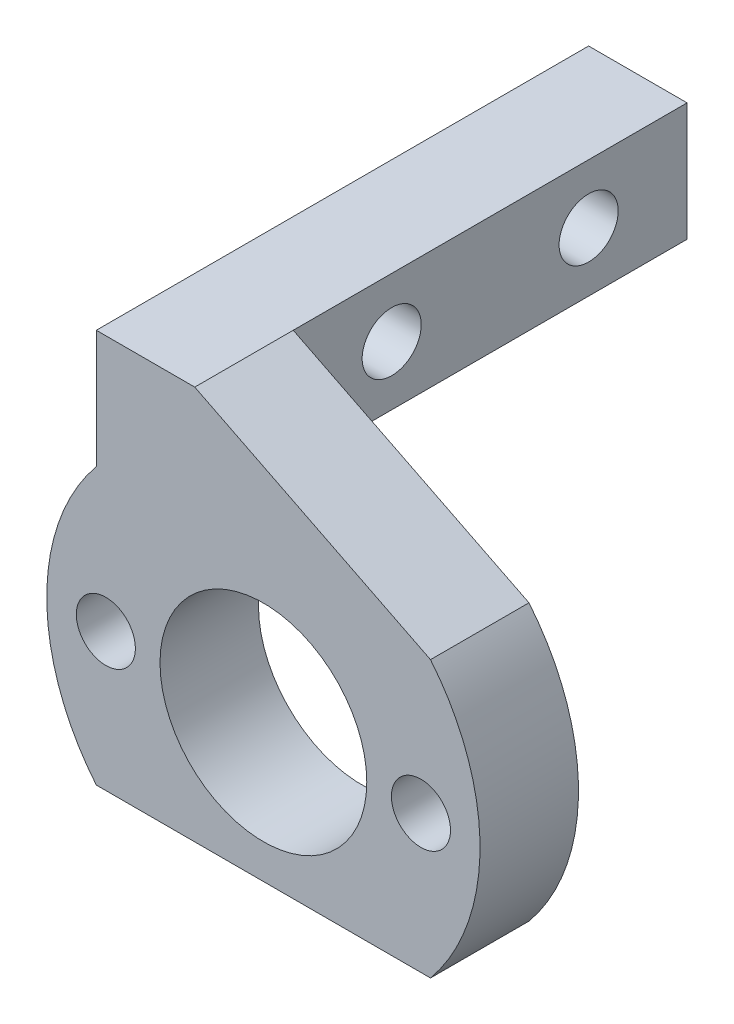
ISO-10303-21;
HEADER;
FILE_DESCRIPTION(('STEP AP214'),'2;1');
FILE_NAME('part.step','',(''),(''),'','','');
FILE_SCHEMA(('AUTOMOTIVE_DESIGN { 1 0 10303 214 1 1 1 1 }'));
ENDSEC;
DATA;
#1=APPLICATION_CONTEXT('core data for automotive mechanical design processes');
#2=APPLICATION_PROTOCOL_DEFINITION('international standard','automotive_design',2000,#1);
#3=PRODUCT_CONTEXT('',#1,'mechanical');
#4=PRODUCT('Part','Part','',(#3));
#5=PRODUCT_RELATED_PRODUCT_CATEGORY('part','',(#4));
#6=PRODUCT_DEFINITION_FORMATION('','',#4);
#7=PRODUCT_DEFINITION_CONTEXT('part definition',#1,'design');
#8=PRODUCT_DEFINITION('design','',#6,#7);
#9=PRODUCT_DEFINITION_SHAPE('','',#8);
#10=(LENGTH_UNIT() NAMED_UNIT(*) SI_UNIT(.MILLI.,.METRE.));
#11=(NAMED_UNIT(*) PLANE_ANGLE_UNIT() SI_UNIT($,.RADIAN.));
#12=(NAMED_UNIT(*) SI_UNIT($,.STERADIAN.) SOLID_ANGLE_UNIT());
#13=UNCERTAINTY_MEASURE_WITH_UNIT(LENGTH_MEASURE(1.E-05),#10,'distance_accuracy_value','');
#14=(GEOMETRIC_REPRESENTATION_CONTEXT(3) GLOBAL_UNCERTAINTY_ASSIGNED_CONTEXT((#13)) GLOBAL_UNIT_ASSIGNED_CONTEXT((#10,
#11,#12)) REPRESENTATION_CONTEXT('',''));
#15=CARTESIAN_POINT('',(0.,0.,0.));
#16=DIRECTION('',(0.,0.,1.));
#17=DIRECTION('',(1.,0.,0.));
#18=AXIS2_PLACEMENT_3D('',#15,#16,#17);
#19=CARTESIAN_POINT('',(5.,0.,0.));
#20=DIRECTION('',(-1.,0.,0.));
#21=DIRECTION('',(0.,0.,1.));
#22=AXIS2_PLACEMENT_3D('',#19,#20,#21);
#23=PLANE('',#22);
#24=DIRECTION('',(0.,-1.,0.));
#25=VECTOR('',#24,1.);
#26=CARTESIAN_POINT('',(5.,0.,0.));
#27=LINE('',#26,#25);
#28=CARTESIAN_POINT('',(5.,6.,0.));
#29=VERTEX_POINT('',#28);
#30=CARTESIAN_POINT('',(5.,0.,0.));
#31=VERTEX_POINT('',#30);
#32=EDGE_CURVE('E110',#29,#31,#27,.T.);
#33=ORIENTED_EDGE('',*,*,#32,.T.);
#34=DIRECTION('',(0.,0.,-1.));
#35=VECTOR('',#34,1.);
#36=CARTESIAN_POINT('',(5.,0.,0.));
#37=LINE('',#36,#35);
#38=CARTESIAN_POINT('',(5.,0.,-20.));
#39=VERTEX_POINT('',#38);
#40=EDGE_CURVE('E114',#31,#39,#37,.T.);
#41=ORIENTED_EDGE('',*,*,#40,.T.);
#42=DIRECTION('',(0.,1.,0.));
#43=VECTOR('',#42,1.);
#44=CARTESIAN_POINT('',(5.,0.,-20.));
#45=LINE('',#44,#43);
#46=CARTESIAN_POINT('',(5.,6.,-20.));
#47=VERTEX_POINT('',#46);
#48=EDGE_CURVE('E59',#39,#47,#45,.T.);
#49=ORIENTED_EDGE('',*,*,#48,.T.);
#50=DIRECTION('',(0.,0.,1.));
#51=VECTOR('',#50,1.);
#52=CARTESIAN_POINT('',(5.,6.,0.));
#53=LINE('',#52,#51);
#54=EDGE_CURVE('E119',#47,#29,#53,.T.);
#55=ORIENTED_EDGE('',*,*,#54,.T.);
#56=EDGE_LOOP('',(#33,#41,#49,#55));
#57=FACE_BOUND('',#56,.T.);
#58=CARTESIAN_POINT('',(5.,3.,-5.));
#59=DIRECTION('',(1.,0.,0.));
#60=DIRECTION('',(0.,0.,-1.));
#61=AXIS2_PLACEMENT_3D('',#58,#59,#60);
#62=CIRCLE('',#61,1.5);
#63=CARTESIAN_POINT('',(5.,3.,-6.5));
#64=VERTEX_POINT('',#63);
#65=EDGE_CURVE('E138',#64,#64,#62,.T.);
#66=ORIENTED_EDGE('',*,*,#65,.F.);
#67=EDGE_LOOP('',(#66));
#68=FACE_BOUND('',#67,.T.);
#69=CARTESIAN_POINT('',(5.,3.,-15.));
#70=DIRECTION('',(1.,0.,0.));
#71=DIRECTION('',(0.,0.,-1.));
#72=AXIS2_PLACEMENT_3D('',#69,#70,#71);
#73=CIRCLE('',#72,1.5);
#74=CARTESIAN_POINT('',(5.,3.,-16.5));
#75=VERTEX_POINT('',#74);
#76=EDGE_CURVE('E219',#75,#75,#73,.T.);
#77=ORIENTED_EDGE('',*,*,#76,.F.);
#78=EDGE_LOOP('',(#77));
#79=FACE_BOUND('',#78,.T.);
#80=ADVANCED_FACE('F41',(#57,#68,#79),#23,.F.);
#81=CARTESIAN_POINT('',(0.,0.,0.));
#82=DIRECTION('',(-1.,0.,0.));
#83=DIRECTION('',(0.,0.,1.));
#84=AXIS2_PLACEMENT_3D('',#81,#82,#83);
#85=PLANE('',#84);
#86=CARTESIAN_POINT('',(0.,3.,-5.));
#87=DIRECTION('',(1.,0.,0.));
#88=DIRECTION('',(0.,0.,-1.));
#89=AXIS2_PLACEMENT_3D('',#86,#87,#88);
#90=CIRCLE('',#89,1.5);
#91=CARTESIAN_POINT('',(0.,3.,-6.5));
#92=VERTEX_POINT('',#91);
#93=EDGE_CURVE('E128',#92,#92,#90,.T.);
#94=ORIENTED_EDGE('',*,*,#93,.T.);
#95=EDGE_LOOP('',(#94));
#96=FACE_BOUND('',#95,.T.);
#97=DIRECTION('',(0.,0.,-1.));
#98=VECTOR('',#97,1.);
#99=CARTESIAN_POINT('',(0.,0.,0.));
#100=LINE('',#99,#98);
#101=CARTESIAN_POINT('',(0.,0.,0.));
#102=VERTEX_POINT('',#101);
#103=CARTESIAN_POINT('',(0.,0.,-20.));
#104=VERTEX_POINT('',#103);
#105=EDGE_CURVE('E70',#102,#104,#100,.T.);
#106=ORIENTED_EDGE('',*,*,#105,.F.);
#107=DIRECTION('',(0.,0.,-1.));
#108=VECTOR('',#107,1.);
#109=CARTESIAN_POINT('',(0.,0.,5.));
#110=LINE('',#109,#108);
#111=CARTESIAN_POINT('',(0.,0.,5.));
#112=VERTEX_POINT('',#111);
#113=EDGE_CURVE('E205',#112,#102,#110,.T.);
#114=ORIENTED_EDGE('',*,*,#113,.F.);
#115=DIRECTION('',(0.,1.,0.));
#116=VECTOR('',#115,1.);
#117=CARTESIAN_POINT('',(0.,0.,5.));
#118=LINE('',#117,#116);
#119=CARTESIAN_POINT('',(0.,6.,5.));
#120=VERTEX_POINT('',#119);
#121=EDGE_CURVE('E152',#112,#120,#118,.T.);
#122=ORIENTED_EDGE('',*,*,#121,.T.);
#123=DIRECTION('',(0.,0.,1.));
#124=VECTOR('',#123,1.);
#125=CARTESIAN_POINT('',(0.,6.,0.));
#126=LINE('',#125,#124);
#127=CARTESIAN_POINT('',(0.,6.,-20.));
#128=VERTEX_POINT('',#127);
#129=EDGE_CURVE('E121',#128,#120,#126,.T.);
#130=ORIENTED_EDGE('',*,*,#129,.F.);
#131=DIRECTION('',(0.,1.,0.));
#132=VECTOR('',#131,1.);
#133=CARTESIAN_POINT('',(0.,0.,-20.));
#134=LINE('',#133,#132);
#135=EDGE_CURVE('E125',#104,#128,#134,.T.);
#136=ORIENTED_EDGE('',*,*,#135,.F.);
#137=EDGE_LOOP('',(#106,#114,#122,#130,#136));
#138=FACE_BOUND('',#137,.T.);
#139=CARTESIAN_POINT('',(0.,3.,-15.));
#140=DIRECTION('',(1.,0.,0.));
#141=DIRECTION('',(0.,0.,-1.));
#142=AXIS2_PLACEMENT_3D('',#139,#140,#141);
#143=CIRCLE('',#142,1.5);
#144=CARTESIAN_POINT('',(0.,3.,-16.5));
#145=VERTEX_POINT('',#144);
#146=EDGE_CURVE('E218',#145,#145,#143,.T.);
#147=ORIENTED_EDGE('',*,*,#146,.T.);
#148=EDGE_LOOP('',(#147));
#149=FACE_BOUND('',#148,.T.);
#150=ADVANCED_FACE('F149',(#96,#138,#149),#85,.T.);
#151=CARTESIAN_POINT('',(5.,0.,0.));
#152=DIRECTION('',(0.,1.,0.));
#153=DIRECTION('',(0.,0.,1.));
#154=AXIS2_PLACEMENT_3D('',#151,#152,#153);
#155=PLANE('',#154);
#156=ORIENTED_EDGE('',*,*,#105,.T.);
#157=DIRECTION('',(-1.,0.,0.));
#158=VECTOR('',#157,1.);
#159=CARTESIAN_POINT('',(5.,0.,-20.));
#160=LINE('',#159,#158);
#161=EDGE_CURVE('E51',#39,#104,#160,.T.);
#162=ORIENTED_EDGE('',*,*,#161,.F.);
#163=ORIENTED_EDGE('',*,*,#40,.F.);
#164=DIRECTION('',(-1.,0.,0.));
#165=VECTOR('',#164,1.);
#166=CARTESIAN_POINT('',(5.,0.,0.));
#167=LINE('',#166,#165);
#168=EDGE_CURVE('E11',#31,#102,#167,.T.);
#169=ORIENTED_EDGE('',*,*,#168,.T.);
#170=EDGE_LOOP('',(#156,#162,#163,#169));
#171=FACE_BOUND('',#170,.T.);
#172=ADVANCED_FACE('F43',(#171),#155,.F.);
#173=CARTESIAN_POINT('',(5.,0.,-20.));
#174=DIRECTION('',(0.,0.,1.));
#175=DIRECTION('',(1.,0.,0.));
#176=AXIS2_PLACEMENT_3D('',#173,#174,#175);
#177=PLANE('',#176);
#178=ORIENTED_EDGE('',*,*,#135,.T.);
#179=DIRECTION('',(-1.,0.,0.));
#180=VECTOR('',#179,1.);
#181=CARTESIAN_POINT('',(5.,6.,-20.));
#182=LINE('',#181,#180);
#183=EDGE_CURVE('E135',#47,#128,#182,.T.);
#184=ORIENTED_EDGE('',*,*,#183,.F.);
#185=ORIENTED_EDGE('',*,*,#48,.F.);
#186=ORIENTED_EDGE('',*,*,#161,.T.);
#187=EDGE_LOOP('',(#178,#184,#185,#186));
#188=FACE_BOUND('',#187,.T.);
#189=ADVANCED_FACE('F146',(#188),#177,.F.);
#190=CARTESIAN_POINT('',(5.,6.,0.));
#191=DIRECTION('',(0.,-1.,0.));
#192=DIRECTION('',(0.,0.,-1.));
#193=AXIS2_PLACEMENT_3D('',#190,#191,#192);
#194=PLANE('',#193);
#195=ORIENTED_EDGE('',*,*,#129,.T.);
#196=DIRECTION('',(1.,0.,0.));
#197=VECTOR('',#196,1.);
#198=CARTESIAN_POINT('',(0.,6.,5.));
#199=LINE('',#198,#197);
#200=CARTESIAN_POINT('',(5.,6.,5.));
#201=VERTEX_POINT('',#200);
#202=EDGE_CURVE('E158',#120,#201,#199,.T.);
#203=ORIENTED_EDGE('',*,*,#202,.T.);
#204=DIRECTION('',(0.,0.,-1.));
#205=VECTOR('',#204,1.);
#206=CARTESIAN_POINT('',(5.,6.,5.));
#207=LINE('',#206,#205);
#208=EDGE_CURVE('E208',#201,#29,#207,.T.);
#209=ORIENTED_EDGE('',*,*,#208,.T.);
#210=ORIENTED_EDGE('',*,*,#54,.F.);
#211=ORIENTED_EDGE('',*,*,#183,.T.);
#212=EDGE_LOOP('',(#195,#203,#209,#210,#211));
#213=FACE_BOUND('',#212,.T.);
#214=ADVANCED_FACE('F156',(#213),#194,.F.);
#215=CARTESIAN_POINT('',(5.,3.,-5.));
#216=DIRECTION('',(-1.,0.,0.));
#217=DIRECTION('',(0.,0.,1.));
#218=AXIS2_PLACEMENT_3D('',#215,#216,#217);
#219=CYLINDRICAL_SURFACE('',#218,1.5);
#220=ORIENTED_EDGE('',*,*,#65,.T.);
#221=EDGE_LOOP('',(#220));
#222=FACE_BOUND('',#221,.T.);
#223=ORIENTED_EDGE('',*,*,#93,.F.);
#224=EDGE_LOOP('',(#223));
#225=FACE_BOUND('',#224,.T.);
#226=ADVANCED_FACE('F234',(#222,#225),#219,.F.);
#227=CARTESIAN_POINT('',(5.,3.,-15.));
#228=DIRECTION('',(-1.,0.,0.));
#229=DIRECTION('',(0.,0.,1.));
#230=AXIS2_PLACEMENT_3D('',#227,#228,#229);
#231=CYLINDRICAL_SURFACE('',#230,1.5);
#232=ORIENTED_EDGE('',*,*,#76,.T.);
#233=EDGE_LOOP('',(#232));
#234=FACE_BOUND('',#233,.T.);
#235=ORIENTED_EDGE('',*,*,#146,.F.);
#236=EDGE_LOOP('',(#235));
#237=FACE_BOUND('',#236,.T.);
#238=ADVANCED_FACE('F236',(#234,#237),#231,.F.);
#239=CARTESIAN_POINT('',(0.,-14.,5.));
#240=DIRECTION('',(0.,1.,0.));
#241=DIRECTION('',(0.,0.,1.));
#242=AXIS2_PLACEMENT_3D('',#239,#240,#241);
#243=PLANE('',#242);
#244=DIRECTION('',(1.,0.,0.));
#245=VECTOR('',#244,1.);
#246=CARTESIAN_POINT('',(0.,-14.,0.));
#247=LINE('',#246,#245);
#248=CARTESIAN_POINT('',(0.,-14.,0.));
#249=VERTEX_POINT('',#248);
#250=CARTESIAN_POINT('',(16.9705627484771,-14.,0.));
#251=VERTEX_POINT('',#250);
#252=EDGE_CURVE('E188',#249,#251,#247,.T.);
#253=ORIENTED_EDGE('',*,*,#252,.T.);
#254=DIRECTION('',(0.,0.,-1.));
#255=VECTOR('',#254,1.);
#256=CARTESIAN_POINT('',(16.9705627484771,-14.,5.));
#257=LINE('',#256,#255);
#258=CARTESIAN_POINT('',(16.9705627484771,-14.,5.));
#259=VERTEX_POINT('',#258);
#260=EDGE_CURVE('E214',#259,#251,#257,.T.);
#261=ORIENTED_EDGE('',*,*,#260,.F.);
#262=DIRECTION('',(1.,0.,0.));
#263=VECTOR('',#262,1.);
#264=CARTESIAN_POINT('',(0.,-14.,5.));
#265=LINE('',#264,#263);
#266=CARTESIAN_POINT('',(0.,-14.,5.));
#267=VERTEX_POINT('',#266);
#268=EDGE_CURVE('E398',#267,#259,#265,.T.);
#269=ORIENTED_EDGE('',*,*,#268,.F.);
#270=DIRECTION('',(0.,0.,-1.));
#271=VECTOR('',#270,1.);
#272=CARTESIAN_POINT('',(0.,-14.,5.));
#273=LINE('',#272,#271);
#274=EDGE_CURVE('E175',#267,#249,#273,.T.);
#275=ORIENTED_EDGE('',*,*,#274,.T.);
#276=EDGE_LOOP('',(#253,#261,#269,#275));
#277=FACE_BOUND('',#276,.T.);
#278=ADVANCED_FACE('F242',(#277),#243,.F.);
#279=CARTESIAN_POINT('',(8.48528137423857,-7.,5.));
#280=DIRECTION('',(0.,0.,-1.));
#281=DIRECTION('',(-1.,0.,0.));
#282=AXIS2_PLACEMENT_3D('',#279,#280,#281);
#283=CYLINDRICAL_SURFACE('',#282,11.);
#284=CARTESIAN_POINT('',(8.48528137423857,-7.,0.));
#285=DIRECTION('',(0.,0.,1.));
#286=DIRECTION('',(1.,0.,0.));
#287=AXIS2_PLACEMENT_3D('',#284,#285,#286);
#288=CIRCLE('',#287,11.);
#289=CARTESIAN_POINT('',(16.9705627484771,0.,0.));
#290=VERTEX_POINT('',#289);
#291=EDGE_CURVE('E192',#251,#290,#288,.T.);
#292=ORIENTED_EDGE('',*,*,#291,.T.);
#293=DIRECTION('',(0.,0.,-1.));
#294=VECTOR('',#293,1.);
#295=CARTESIAN_POINT('',(16.9705627484771,0.,5.));
#296=LINE('',#295,#294);
#297=CARTESIAN_POINT('',(16.9705627484771,0.,5.));
#298=VERTEX_POINT('',#297);
#299=EDGE_CURVE('E211',#298,#290,#296,.T.);
#300=ORIENTED_EDGE('',*,*,#299,.F.);
#301=CARTESIAN_POINT('',(8.48528137423857,-7.,5.));
#302=DIRECTION('',(0.,0.,1.));
#303=DIRECTION('',(1.,0.,0.));
#304=AXIS2_PLACEMENT_3D('',#301,#302,#303);
#305=CIRCLE('',#304,11.);
#306=EDGE_CURVE('E169',#259,#298,#305,.T.);
#307=ORIENTED_EDGE('',*,*,#306,.F.);
#308=ORIENTED_EDGE('',*,*,#260,.T.);
#309=EDGE_LOOP('',(#292,#300,#307,#308));
#310=FACE_BOUND('',#309,.T.);
#311=ADVANCED_FACE('F301',(#310),#283,.T.);
#312=CARTESIAN_POINT('',(3.40747035377971,6.79822294724927,5.));
#313=DIRECTION('',(0.448092753963001,0.893987071408672,0.));
#314=DIRECTION('',(-0.893987071408672,0.448092753963001,0.));
#315=AXIS2_PLACEMENT_3D('',#312,#313,#314);
#316=PLANE('',#315);
#317=DIRECTION('',(0.893987071408672,-0.448092753963001,0.));
#318=VECTOR('',#317,1.);
#319=CARTESIAN_POINT('',(3.40747035377971,6.79822294724927,0.));
#320=LINE('',#319,#318);
#321=EDGE_CURVE('E196',#29,#290,#320,.T.);
#322=ORIENTED_EDGE('',*,*,#321,.F.);
#323=ORIENTED_EDGE('',*,*,#208,.F.);
#324=DIRECTION('',(0.893987071408672,-0.448092753963001,0.));
#325=VECTOR('',#324,1.);
#326=CARTESIAN_POINT('',(3.40747035377971,6.79822294724927,5.));
#327=LINE('',#326,#325);
#328=EDGE_CURVE('E163',#201,#298,#327,.T.);
#329=ORIENTED_EDGE('',*,*,#328,.T.);
#330=ORIENTED_EDGE('',*,*,#299,.T.);
#331=EDGE_LOOP('',(#322,#323,#329,#330));
#332=FACE_BOUND('',#331,.T.);
#333=ADVANCED_FACE('F310',(#332),#316,.T.);
#334=CARTESIAN_POINT('',(16.4852813742386,-7.,5.));
#335=DIRECTION('',(0.,0.,-1.));
#336=DIRECTION('',(-1.,0.,0.));
#337=AXIS2_PLACEMENT_3D('',#334,#335,#336);
#338=CYLINDRICAL_SURFACE('',#337,1.5);
#339=CARTESIAN_POINT('',(16.4852813742386,-7.,5.));
#340=DIRECTION('',(0.,0.,1.));
#341=DIRECTION('',(1.,0.,0.));
#342=AXIS2_PLACEMENT_3D('',#339,#340,#341);
#343=CIRCLE('',#342,1.5);
#344=CARTESIAN_POINT('',(17.9852813742386,-7.,5.));
#345=VERTEX_POINT('',#344);
#346=EDGE_CURVE('E396',#345,#345,#343,.T.);
#347=ORIENTED_EDGE('',*,*,#346,.T.);
#348=EDGE_LOOP('',(#347));
#349=FACE_BOUND('',#348,.T.);
#350=CARTESIAN_POINT('',(16.4852813742386,-7.,0.));
#351=DIRECTION('',(0.,0.,1.));
#352=DIRECTION('',(1.,0.,0.));
#353=AXIS2_PLACEMENT_3D('',#350,#351,#352);
#354=CIRCLE('',#353,1.5);
#355=CARTESIAN_POINT('',(17.9852813742386,-7.,0.));
#356=VERTEX_POINT('',#355);
#357=EDGE_CURVE('E184',#356,#356,#354,.T.);
#358=ORIENTED_EDGE('',*,*,#357,.F.);
#359=EDGE_LOOP('',(#358));
#360=FACE_BOUND('',#359,.T.);
#361=ADVANCED_FACE('F319',(#349,#360),#338,.F.);
#362=CARTESIAN_POINT('',(0.485281374238575,-7.,5.));
#363=DIRECTION('',(0.,0.,-1.));
#364=DIRECTION('',(-1.,0.,0.));
#365=AXIS2_PLACEMENT_3D('',#362,#363,#364);
#366=CYLINDRICAL_SURFACE('',#365,1.5);
#367=CARTESIAN_POINT('',(0.485281374238575,-7.,5.));
#368=DIRECTION('',(0.,0.,1.));
#369=DIRECTION('',(1.,0.,0.));
#370=AXIS2_PLACEMENT_3D('',#367,#368,#369);
#371=CIRCLE('',#370,1.5);
#372=CARTESIAN_POINT('',(1.98528137423858,-7.,5.));
#373=VERTEX_POINT('',#372);
#374=EDGE_CURVE('E393',#373,#373,#371,.T.);
#375=ORIENTED_EDGE('',*,*,#374,.T.);
#376=EDGE_LOOP('',(#375));
#377=FACE_BOUND('',#376,.T.);
#378=CARTESIAN_POINT('',(0.485281374238575,-7.,0.));
#379=DIRECTION('',(0.,0.,1.));
#380=DIRECTION('',(1.,0.,0.));
#381=AXIS2_PLACEMENT_3D('',#378,#379,#380);
#382=CIRCLE('',#381,1.5);
#383=CARTESIAN_POINT('',(1.98528137423858,-7.,0.));
#384=VERTEX_POINT('',#383);
#385=EDGE_CURVE('E180',#384,#384,#382,.T.);
#386=ORIENTED_EDGE('',*,*,#385,.F.);
#387=EDGE_LOOP('',(#386));
#388=FACE_BOUND('',#387,.T.);
#389=ADVANCED_FACE('F328',(#377,#388),#366,.F.);
#390=CARTESIAN_POINT('',(8.48528137423857,-7.,5.));
#391=DIRECTION('',(0.,0.,-1.));
#392=DIRECTION('',(-1.,0.,0.));
#393=AXIS2_PLACEMENT_3D('',#390,#391,#392);
#394=CYLINDRICAL_SURFACE('',#393,5.24999999999999);
#395=CARTESIAN_POINT('',(8.48528137423857,-7.,5.));
#396=DIRECTION('',(0.,0.,1.));
#397=DIRECTION('',(1.,0.,0.));
#398=AXIS2_PLACEMENT_3D('',#395,#396,#397);
#399=CIRCLE('',#398,5.24999999999999);
#400=CARTESIAN_POINT('',(13.7352813742386,-7.,5.));
#401=VERTEX_POINT('',#400);
#402=EDGE_CURVE('E201',#401,#401,#399,.T.);
#403=ORIENTED_EDGE('',*,*,#402,.T.);
#404=EDGE_LOOP('',(#403));
#405=FACE_BOUND('',#404,.T.);
#406=CARTESIAN_POINT('',(8.48528137423857,-7.,0.));
#407=DIRECTION('',(0.,0.,1.));
#408=DIRECTION('',(1.,0.,0.));
#409=AXIS2_PLACEMENT_3D('',#406,#407,#408);
#410=CIRCLE('',#409,5.24999999999999);
#411=CARTESIAN_POINT('',(13.7352813742386,-7.,0.));
#412=VERTEX_POINT('',#411);
#413=EDGE_CURVE('E176',#412,#412,#410,.T.);
#414=ORIENTED_EDGE('',*,*,#413,.F.);
#415=EDGE_LOOP('',(#414));
#416=FACE_BOUND('',#415,.T.);
#417=ADVANCED_FACE('F337',(#405,#416),#394,.F.);
#418=CARTESIAN_POINT('',(8.48528137423857,-7.,5.));
#419=DIRECTION('',(0.,0.,-1.));
#420=DIRECTION('',(-1.,0.,0.));
#421=AXIS2_PLACEMENT_3D('',#418,#419,#420);
#422=CYLINDRICAL_SURFACE('',#421,11.);
#423=CARTESIAN_POINT('',(8.48528137423857,-7.,0.));
#424=DIRECTION('',(0.,0.,1.));
#425=DIRECTION('',(1.,0.,0.));
#426=AXIS2_PLACEMENT_3D('',#423,#424,#425);
#427=CIRCLE('',#426,11.);
#428=EDGE_CURVE('E113',#102,#249,#427,.T.);
#429=ORIENTED_EDGE('',*,*,#428,.T.);
#430=ORIENTED_EDGE('',*,*,#274,.F.);
#431=CARTESIAN_POINT('',(8.48528137423857,-7.,5.));
#432=DIRECTION('',(0.,0.,1.));
#433=DIRECTION('',(1.,0.,0.));
#434=AXIS2_PLACEMENT_3D('',#431,#432,#433);
#435=CIRCLE('',#434,11.);
#436=EDGE_CURVE('E80',#112,#267,#435,.T.);
#437=ORIENTED_EDGE('',*,*,#436,.F.);
#438=ORIENTED_EDGE('',*,*,#113,.T.);
#439=EDGE_LOOP('',(#429,#430,#437,#438));
#440=FACE_BOUND('',#439,.T.);
#441=ADVANCED_FACE('F346',(#440),#422,.T.);
#442=CARTESIAN_POINT('',(0.,0.,5.));
#443=DIRECTION('',(0.,0.,1.));
#444=DIRECTION('',(1.,0.,0.));
#445=AXIS2_PLACEMENT_3D('',#442,#443,#444);
#446=PLANE('',#445);
#447=ORIENTED_EDGE('',*,*,#402,.F.);
#448=EDGE_LOOP('',(#447));
#449=FACE_BOUND('',#448,.T.);
#450=ORIENTED_EDGE('',*,*,#374,.F.);
#451=EDGE_LOOP('',(#450));
#452=FACE_BOUND('',#451,.T.);
#453=ORIENTED_EDGE('',*,*,#346,.F.);
#454=EDGE_LOOP('',(#453));
#455=FACE_BOUND('',#454,.T.);
#456=ORIENTED_EDGE('',*,*,#268,.T.);
#457=ORIENTED_EDGE('',*,*,#306,.T.);
#458=ORIENTED_EDGE('',*,*,#328,.F.);
#459=ORIENTED_EDGE('',*,*,#202,.F.);
#460=ORIENTED_EDGE('',*,*,#121,.F.);
#461=ORIENTED_EDGE('',*,*,#436,.T.);
#462=EDGE_LOOP('',(#456,#457,#458,#459,#460,#461));
#463=FACE_BOUND('',#462,.T.);
#464=ADVANCED_FACE('F160',(#449,#452,#455,#463),#446,.T.);
#465=CARTESIAN_POINT('',(0.,0.,0.));
#466=DIRECTION('',(0.,0.,1.));
#467=DIRECTION('',(1.,0.,0.));
#468=AXIS2_PLACEMENT_3D('',#465,#466,#467);
#469=PLANE('',#468);
#470=ORIENTED_EDGE('',*,*,#168,.F.);
#471=ORIENTED_EDGE('',*,*,#32,.F.);
#472=ORIENTED_EDGE('',*,*,#321,.T.);
#473=ORIENTED_EDGE('',*,*,#291,.F.);
#474=ORIENTED_EDGE('',*,*,#252,.F.);
#475=ORIENTED_EDGE('',*,*,#428,.F.);
#476=EDGE_LOOP('',(#470,#471,#472,#473,#474,#475));
#477=FACE_BOUND('',#476,.T.);
#478=ORIENTED_EDGE('',*,*,#413,.T.);
#479=EDGE_LOOP('',(#478));
#480=FACE_BOUND('',#479,.T.);
#481=ORIENTED_EDGE('',*,*,#385,.T.);
#482=EDGE_LOOP('',(#481));
#483=FACE_BOUND('',#482,.T.);
#484=ORIENTED_EDGE('',*,*,#357,.T.);
#485=EDGE_LOOP('',(#484));
#486=FACE_BOUND('',#485,.T.);
#487=ADVANCED_FACE('F106',(#477,#480,#483,#486),#469,.F.);
#488=CLOSED_SHELL('',(#80,#150,#172,#189,#214,#226,#238,#278,#311,#333,#361,#389,#417,#441,#464,#487));
#489=MANIFOLD_SOLID_BREP('B2',#488);
#490=ADVANCED_BREP_SHAPE_REPRESENTATION('',(#18,#489),#14);
#491=SHAPE_DEFINITION_REPRESENTATION(#9,#490);
ENDSEC;
END-ISO-10303-21;
